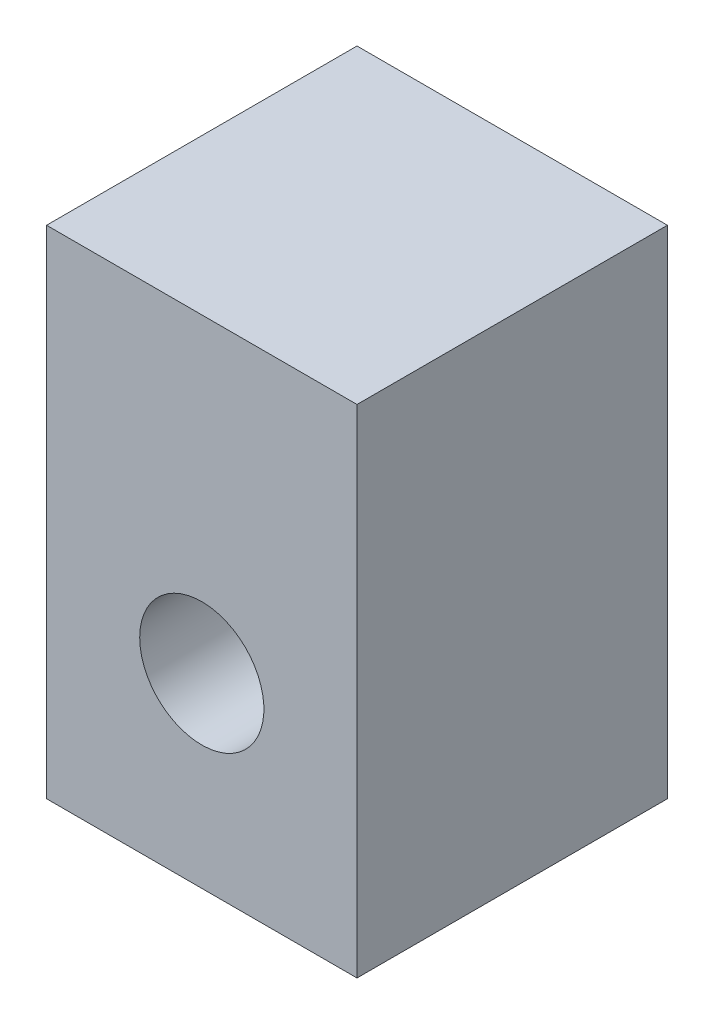
ISO-10303-21;
HEADER;
FILE_DESCRIPTION(('STEP AP214'),'2;1');
FILE_NAME('part.step','',(''),(''),'','','');
FILE_SCHEMA(('AUTOMOTIVE_DESIGN { 1 0 10303 214 1 1 1 1 }'));
ENDSEC;
DATA;
#1=APPLICATION_CONTEXT('core data for automotive mechanical design processes');
#2=APPLICATION_PROTOCOL_DEFINITION('international standard','automotive_design',2000,#1);
#3=PRODUCT_CONTEXT('',#1,'mechanical');
#4=PRODUCT('Part','Part','',(#3));
#5=PRODUCT_RELATED_PRODUCT_CATEGORY('part','',(#4));
#6=PRODUCT_DEFINITION_FORMATION('','',#4);
#7=PRODUCT_DEFINITION_CONTEXT('part definition',#1,'design');
#8=PRODUCT_DEFINITION('design','',#6,#7);
#9=PRODUCT_DEFINITION_SHAPE('','',#8);
#10=(LENGTH_UNIT() NAMED_UNIT(*) SI_UNIT(.MILLI.,.METRE.));
#11=(NAMED_UNIT(*) PLANE_ANGLE_UNIT() SI_UNIT($,.RADIAN.));
#12=(NAMED_UNIT(*) SI_UNIT($,.STERADIAN.) SOLID_ANGLE_UNIT());
#13=UNCERTAINTY_MEASURE_WITH_UNIT(LENGTH_MEASURE(1.E-05),#10,'distance_accuracy_value','');
#14=(GEOMETRIC_REPRESENTATION_CONTEXT(3) GLOBAL_UNCERTAINTY_ASSIGNED_CONTEXT((#13)) GLOBAL_UNIT_ASSIGNED_CONTEXT((#10,
#11,#12)) REPRESENTATION_CONTEXT('',''));
#15=CARTESIAN_POINT('',(0.,0.,0.));
#16=DIRECTION('',(0.,0.,1.));
#17=DIRECTION('',(1.,0.,0.));
#18=AXIS2_PLACEMENT_3D('',#15,#16,#17);
#19=CARTESIAN_POINT('',(-74.5399908312403,62.5000000000008,10.0000000006505));
#20=DIRECTION('',(1.,0.,-8.72301631056176E-12));
#21=DIRECTION('',(-8.72301631056176E-12,0.,-1.));
#22=AXIS2_PLACEMENT_3D('',#19,#20,#21);
#23=PLANE('',#22);
#24=DIRECTION('',(0.,-1.,0.));
#25=VECTOR('',#24,1.);
#26=CARTESIAN_POINT('',(-74.5399908313276,62.5000000000009,6.50545394913453E-10));
#27=LINE('',#26,#25);
#28=CARTESIAN_POINT('',(-74.5399908313276,62.5000000000009,6.50545394913453E-10));
#29=VERTEX_POINT('',#28);
#30=CARTESIAN_POINT('',(-74.5399908313276,46.500000000001,6.50460444103173E-10));
#31=VERTEX_POINT('',#30);
#32=EDGE_CURVE('E98',#29,#31,#27,.T.);
#33=ORIENTED_EDGE('',*,*,#32,.F.);
#34=DIRECTION('',(-8.72301631056176E-12,0.,-1.));
#35=VECTOR('',#34,1.);
#36=CARTESIAN_POINT('',(-74.5399908312403,62.5000000000008,10.0000000006505));
#37=LINE('',#36,#35);
#38=CARTESIAN_POINT('',(-74.5399908312403,62.5000000000008,10.0000000006505));
#39=VERTEX_POINT('',#38);
#40=EDGE_CURVE('E11',#39,#29,#37,.T.);
#41=ORIENTED_EDGE('',*,*,#40,.F.);
#42=DIRECTION('',(0.,-1.,0.));
#43=VECTOR('',#42,1.);
#44=CARTESIAN_POINT('',(-74.5399908312403,62.5000000000008,10.0000000006505));
#45=LINE('',#44,#43);
#46=CARTESIAN_POINT('',(-74.5399908312403,46.5000000000009,10.0000000006505));
#47=VERTEX_POINT('',#46);
#48=EDGE_CURVE('E91',#39,#47,#45,.T.);
#49=ORIENTED_EDGE('',*,*,#48,.T.);
#50=DIRECTION('',(-8.72301631056176E-12,0.,-1.));
#51=VECTOR('',#50,1.);
#52=CARTESIAN_POINT('',(-74.5399908312403,46.5000000000009,10.0000000006505));
#53=LINE('',#52,#51);
#54=EDGE_CURVE('E36',#47,#31,#53,.T.);
#55=ORIENTED_EDGE('',*,*,#54,.T.);
#56=EDGE_LOOP('',(#33,#41,#49,#55));
#57=FACE_BOUND('',#56,.T.);
#58=ADVANCED_FACE('F33',(#57),#23,.T.);
#59=CARTESIAN_POINT('',(-74.5399908312403,62.5000000000008,10.0000000006505));
#60=DIRECTION('',(0.,1.,0.));
#61=DIRECTION('',(0.,0.,1.));
#62=AXIS2_PLACEMENT_3D('',#59,#60,#61);
#63=PLANE('',#62);
#64=DIRECTION('',(1.,0.,-8.72301631056176E-12));
#65=VECTOR('',#64,1.);
#66=CARTESIAN_POINT('',(-74.5399908313276,62.5000000000009,6.50545394913453E-10));
#67=LINE('',#66,#65);
#68=CARTESIAN_POINT('',(-84.5399908313278,62.5000000000009,7.37775558019072E-10));
#69=VERTEX_POINT('',#68);
#70=EDGE_CURVE('E93',#69,#29,#67,.T.);
#71=ORIENTED_EDGE('',*,*,#70,.F.);
#72=DIRECTION('',(-8.72301631056176E-12,0.,-1.));
#73=VECTOR('',#72,1.);
#74=CARTESIAN_POINT('',(-84.5399908312405,62.5000000000008,10.0000000007378));
#75=LINE('',#74,#73);
#76=CARTESIAN_POINT('',(-84.5399908312405,62.5000000000008,10.0000000007378));
#77=VERTEX_POINT('',#76);
#78=EDGE_CURVE('E42',#77,#69,#75,.T.);
#79=ORIENTED_EDGE('',*,*,#78,.F.);
#80=DIRECTION('',(1.,0.,-8.72301631056176E-12));
#81=VECTOR('',#80,1.);
#82=CARTESIAN_POINT('',(-74.5399908312403,62.5000000000008,10.0000000006505));
#83=LINE('',#82,#81);
#84=EDGE_CURVE('E88',#77,#39,#83,.T.);
#85=ORIENTED_EDGE('',*,*,#84,.T.);
#86=ORIENTED_EDGE('',*,*,#40,.T.);
#87=EDGE_LOOP('',(#71,#79,#85,#86));
#88=FACE_BOUND('',#87,.T.);
#89=ADVANCED_FACE('F109',(#88),#63,.T.);
#90=CARTESIAN_POINT('',(-84.5399908312405,62.5000000000008,10.0000000007378));
#91=DIRECTION('',(-1.,0.,8.72301631056176E-12));
#92=DIRECTION('',(8.72301631056176E-12,0.,1.));
#93=AXIS2_PLACEMENT_3D('',#90,#91,#92);
#94=PLANE('',#93);
#95=DIRECTION('',(0.,1.,0.));
#96=VECTOR('',#95,1.);
#97=CARTESIAN_POINT('',(-84.5399908313278,62.5000000000009,7.37775558019072E-10));
#98=LINE('',#97,#96);
#99=CARTESIAN_POINT('',(-84.5399908313278,46.500000000001,7.37690607208792E-10));
#100=VERTEX_POINT('',#99);
#101=EDGE_CURVE('E83',#100,#69,#98,.T.);
#102=ORIENTED_EDGE('',*,*,#101,.F.);
#103=DIRECTION('',(-8.72301631056176E-12,0.,-1.));
#104=VECTOR('',#103,1.);
#105=CARTESIAN_POINT('',(-84.5399908312405,46.5000000000009,10.0000000007377));
#106=LINE('',#105,#104);
#107=CARTESIAN_POINT('',(-84.5399908312405,46.5000000000009,10.0000000007377));
#108=VERTEX_POINT('',#107);
#109=EDGE_CURVE('E78',#108,#100,#106,.T.);
#110=ORIENTED_EDGE('',*,*,#109,.F.);
#111=DIRECTION('',(0.,1.,0.));
#112=VECTOR('',#111,1.);
#113=CARTESIAN_POINT('',(-84.5399908312405,62.5000000000008,10.0000000007378));
#114=LINE('',#113,#112);
#115=EDGE_CURVE('E81',#108,#77,#114,.T.);
#116=ORIENTED_EDGE('',*,*,#115,.T.);
#117=ORIENTED_EDGE('',*,*,#78,.T.);
#118=EDGE_LOOP('',(#102,#110,#116,#117));
#119=FACE_BOUND('',#118,.T.);
#120=ADVANCED_FACE('F80',(#119),#94,.T.);
#121=CARTESIAN_POINT('',(-74.5399908312403,46.5000000000009,10.0000000006505));
#122=DIRECTION('',(0.,-1.,0.));
#123=DIRECTION('',(0.,0.,-1.));
#124=AXIS2_PLACEMENT_3D('',#121,#122,#123);
#125=PLANE('',#124);
#126=DIRECTION('',(-1.,0.,8.72301631056176E-12));
#127=VECTOR('',#126,1.);
#128=CARTESIAN_POINT('',(-74.5399908313276,46.500000000001,6.50460444103173E-10));
#129=LINE('',#128,#127);
#130=EDGE_CURVE('E101',#31,#100,#129,.T.);
#131=ORIENTED_EDGE('',*,*,#130,.F.);
#132=ORIENTED_EDGE('',*,*,#54,.F.);
#133=DIRECTION('',(-1.,0.,8.72301631056176E-12));
#134=VECTOR('',#133,1.);
#135=CARTESIAN_POINT('',(-74.5399908312403,46.5000000000009,10.0000000006505));
#136=LINE('',#135,#134);
#137=EDGE_CURVE('E87',#47,#108,#136,.T.);
#138=ORIENTED_EDGE('',*,*,#137,.T.);
#139=ORIENTED_EDGE('',*,*,#109,.T.);
#140=EDGE_LOOP('',(#131,#132,#138,#139));
#141=FACE_BOUND('',#140,.T.);
#142=ADVANCED_FACE('F90',(#141),#125,.T.);
#143=CARTESIAN_POINT('',(8.72301631056176E-11,0.,10.));
#144=DIRECTION('',(-8.72301631056176E-12,0.,-1.));
#145=DIRECTION('',(-1.,0.,8.72301631056176E-12));
#146=AXIS2_PLACEMENT_3D('',#143,#144,#145);
#147=PLANE('',#146);
#148=CARTESIAN_POINT('',(-79.5399908312405,52.5000000000009,10.0000000006941));
#149=DIRECTION('',(-8.72301631056176E-12,0.,-1.));
#150=DIRECTION('',(-1.,0.,8.72301631056176E-12));
#151=AXIS2_PLACEMENT_3D('',#148,#149,#150);
#152=CIRCLE('',#151,2.00000000000001);
#153=CARTESIAN_POINT('',(-81.5399908312405,52.5000000000009,10.0000000007116));
#154=VERTEX_POINT('',#153);
#155=EDGE_CURVE('E102',#154,#154,#152,.T.);
#156=ORIENTED_EDGE('',*,*,#155,.T.);
#157=EDGE_LOOP('',(#156));
#158=FACE_BOUND('',#157,.T.);
#159=ORIENTED_EDGE('',*,*,#48,.F.);
#160=ORIENTED_EDGE('',*,*,#84,.F.);
#161=ORIENTED_EDGE('',*,*,#115,.F.);
#162=ORIENTED_EDGE('',*,*,#137,.F.);
#163=EDGE_LOOP('',(#159,#160,#161,#162));
#164=FACE_BOUND('',#163,.T.);
#165=ADVANCED_FACE('F86',(#158,#164),#147,.F.);
#166=CARTESIAN_POINT('',(0.,0.,0.));
#167=DIRECTION('',(-8.72301631056176E-12,0.,-1.));
#168=DIRECTION('',(-1.,0.,8.72301631056176E-12));
#169=AXIS2_PLACEMENT_3D('',#166,#167,#168);
#170=PLANE('',#169);
#171=CARTESIAN_POINT('',(-79.5399908313277,52.5000000000009,6.94107382209838E-10));
#172=DIRECTION('',(-8.72301631056176E-12,0.,-1.));
#173=DIRECTION('',(-1.,0.,8.72301631056176E-12));
#174=AXIS2_PLACEMENT_3D('',#171,#172,#173);
#175=CIRCLE('',#174,2.00000000000001);
#176=CARTESIAN_POINT('',(-81.5399908313277,52.5000000000009,7.11553414830961E-10));
#177=VERTEX_POINT('',#176);
#178=EDGE_CURVE('E139',#177,#177,#175,.T.);
#179=ORIENTED_EDGE('',*,*,#178,.F.);
#180=EDGE_LOOP('',(#179));
#181=FACE_BOUND('',#180,.T.);
#182=ORIENTED_EDGE('',*,*,#32,.T.);
#183=ORIENTED_EDGE('',*,*,#130,.T.);
#184=ORIENTED_EDGE('',*,*,#101,.T.);
#185=ORIENTED_EDGE('',*,*,#70,.T.);
#186=EDGE_LOOP('',(#182,#183,#184,#185));
#187=FACE_BOUND('',#186,.T.);
#188=ADVANCED_FACE('F108',(#181,#187),#170,.T.);
#189=CARTESIAN_POINT('',(-79.5399908312405,52.5000000000009,10.0000000006941));
#190=DIRECTION('',(-8.72301631056176E-12,0.,-1.));
#191=DIRECTION('',(-1.,0.,8.72301631056176E-12));
#192=AXIS2_PLACEMENT_3D('',#189,#190,#191);
#193=CYLINDRICAL_SURFACE('',#192,2.00000000000001);
#194=ORIENTED_EDGE('',*,*,#155,.F.);
#195=EDGE_LOOP('',(#194));
#196=FACE_BOUND('',#195,.T.);
#197=ORIENTED_EDGE('',*,*,#178,.T.);
#198=EDGE_LOOP('',(#197));
#199=FACE_BOUND('',#198,.T.);
#200=ADVANCED_FACE('F127',(#196,#199),#193,.F.);
#201=CLOSED_SHELL('',(#58,#89,#120,#142,#165,#188,#200));
#202=MANIFOLD_SOLID_BREP('B2',#201);
#203=ADVANCED_BREP_SHAPE_REPRESENTATION('',(#18,#202),#14);
#204=SHAPE_DEFINITION_REPRESENTATION(#9,#203);
ENDSEC;
END-ISO-10303-21;
